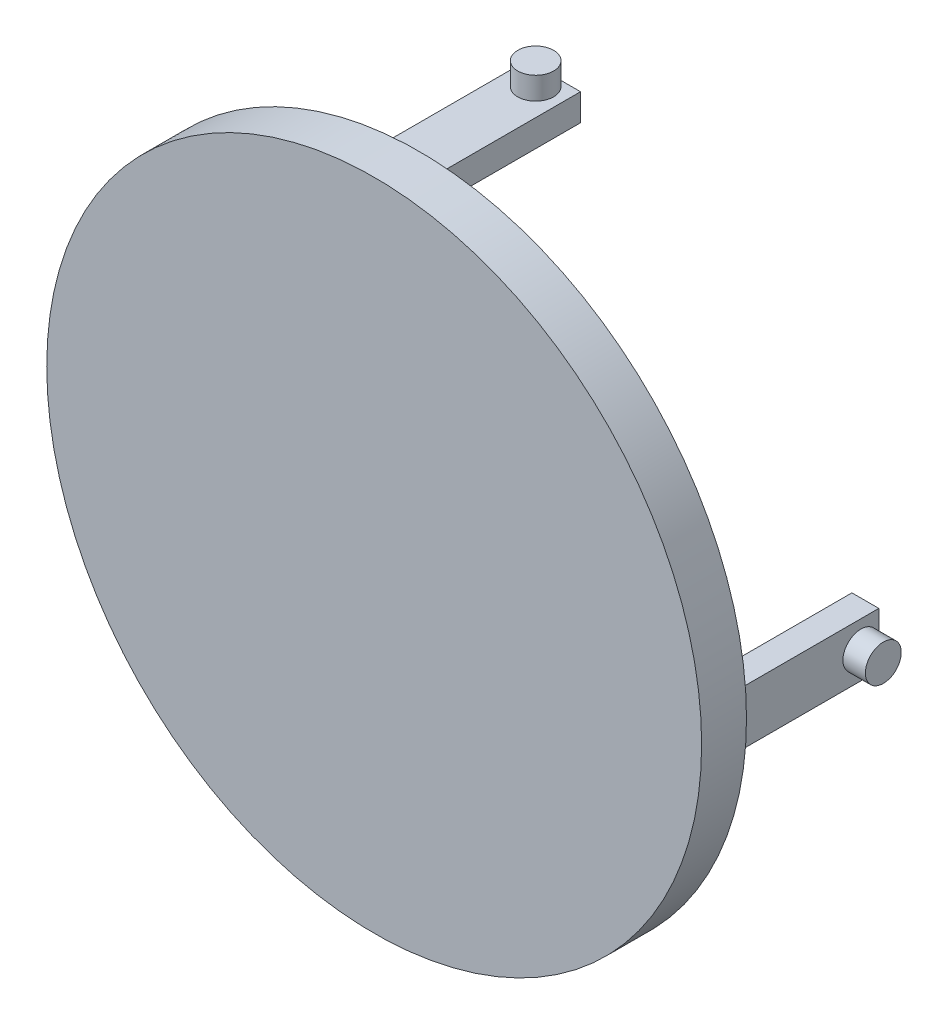
ISO-10303-21;
HEADER;
FILE_DESCRIPTION(('STEP AP214'),'2;1');
FILE_NAME('part.step','',(''),(''),'','','');
FILE_SCHEMA(('AUTOMOTIVE_DESIGN { 1 0 10303 214 1 1 1 1 }'));
ENDSEC;
DATA;
#1=APPLICATION_CONTEXT('core data for automotive mechanical design processes');
#2=APPLICATION_PROTOCOL_DEFINITION('international standard','automotive_design',2000,#1);
#3=PRODUCT_CONTEXT('',#1,'mechanical');
#4=PRODUCT('Part','Part','',(#3));
#5=PRODUCT_RELATED_PRODUCT_CATEGORY('part','',(#4));
#6=PRODUCT_DEFINITION_FORMATION('','',#4);
#7=PRODUCT_DEFINITION_CONTEXT('part definition',#1,'design');
#8=PRODUCT_DEFINITION('design','',#6,#7);
#9=PRODUCT_DEFINITION_SHAPE('','',#8);
#10=(LENGTH_UNIT() NAMED_UNIT(*) SI_UNIT(.MILLI.,.METRE.));
#11=(NAMED_UNIT(*) PLANE_ANGLE_UNIT() SI_UNIT($,.RADIAN.));
#12=(NAMED_UNIT(*) SI_UNIT($,.STERADIAN.) SOLID_ANGLE_UNIT());
#13=UNCERTAINTY_MEASURE_WITH_UNIT(LENGTH_MEASURE(1.E-05),#10,'distance_accuracy_value','');
#14=(GEOMETRIC_REPRESENTATION_CONTEXT(3) GLOBAL_UNCERTAINTY_ASSIGNED_CONTEXT((#13)) GLOBAL_UNIT_ASSIGNED_CONTEXT((#10,
#11,#12)) REPRESENTATION_CONTEXT('',''));
#15=CARTESIAN_POINT('',(0.,0.,0.));
#16=DIRECTION('',(0.,0.,1.));
#17=DIRECTION('',(1.,0.,0.));
#18=AXIS2_PLACEMENT_3D('',#15,#16,#17);
#19=CARTESIAN_POINT('',(0.,0.,0.));
#20=DIRECTION('',(0.,0.,1.));
#21=DIRECTION('',(1.,0.,0.));
#22=AXIS2_PLACEMENT_3D('',#19,#20,#21);
#23=PLANE('',#22);
#24=DIRECTION('',(0.,-1.,0.));
#25=VECTOR('',#24,1.);
#26=CARTESIAN_POINT('',(-33.25,-2.99999999999998,0.));
#27=LINE('',#26,#25);
#28=CARTESIAN_POINT('',(-33.25,3.00000000000002,0.));
#29=VERTEX_POINT('',#28);
#30=CARTESIAN_POINT('',(-33.25,-2.99999999999998,0.));
#31=VERTEX_POINT('',#30);
#32=EDGE_CURVE('E278',#29,#31,#27,.T.);
#33=ORIENTED_EDGE('',*,*,#32,.F.);
#34=DIRECTION('',(1.,0.,0.));
#35=VECTOR('',#34,1.);
#36=CARTESIAN_POINT('',(-33.25,3.00000000000002,0.));
#37=LINE('',#36,#35);
#38=CARTESIAN_POINT('',(-36.25,3.00000000000002,0.));
#39=VERTEX_POINT('',#38);
#40=EDGE_CURVE('E284',#39,#29,#37,.T.);
#41=ORIENTED_EDGE('',*,*,#40,.F.);
#42=DIRECTION('',(0.,1.,0.));
#43=VECTOR('',#42,1.);
#44=CARTESIAN_POINT('',(-36.25,3.00000000000002,0.));
#45=LINE('',#44,#43);
#46=CARTESIAN_POINT('',(-36.25,-2.99999999999998,0.));
#47=VERTEX_POINT('',#46);
#48=EDGE_CURVE('E303',#47,#39,#45,.T.);
#49=ORIENTED_EDGE('',*,*,#48,.F.);
#50=DIRECTION('',(-1.,0.,0.));
#51=VECTOR('',#50,1.);
#52=CARTESIAN_POINT('',(-36.25,-2.99999999999998,0.));
#53=LINE('',#52,#51);
#54=EDGE_CURVE('E299',#31,#47,#53,.T.);
#55=ORIENTED_EDGE('',*,*,#54,.F.);
#56=EDGE_LOOP('',(#33,#41,#49,#55));
#57=FACE_BOUND('',#56,.T.);
#58=DIRECTION('',(-1.,0.,0.));
#59=VECTOR('',#58,1.);
#60=CARTESIAN_POINT('',(33.25,-3.00000000000002,0.));
#61=LINE('',#60,#59);
#62=CARTESIAN_POINT('',(36.25,-3.00000000000002,0.));
#63=VERTEX_POINT('',#62);
#64=CARTESIAN_POINT('',(33.25,-3.00000000000002,0.));
#65=VERTEX_POINT('',#64);
#66=EDGE_CURVE('E189',#63,#65,#61,.T.);
#67=ORIENTED_EDGE('',*,*,#66,.F.);
#68=DIRECTION('',(0.,-1.,0.));
#69=VECTOR('',#68,1.);
#70=CARTESIAN_POINT('',(36.25,2.99999999999998,0.));
#71=LINE('',#70,#69);
#72=CARTESIAN_POINT('',(36.25,2.99999999999998,0.));
#73=VERTEX_POINT('',#72);
#74=EDGE_CURVE('E202',#73,#63,#71,.T.);
#75=ORIENTED_EDGE('',*,*,#74,.F.);
#76=DIRECTION('',(1.,0.,0.));
#77=VECTOR('',#76,1.);
#78=CARTESIAN_POINT('',(36.25,2.99999999999998,0.));
#79=LINE('',#78,#77);
#80=CARTESIAN_POINT('',(33.25,2.99999999999998,0.));
#81=VERTEX_POINT('',#80);
#82=EDGE_CURVE('E198',#81,#73,#79,.T.);
#83=ORIENTED_EDGE('',*,*,#82,.F.);
#84=DIRECTION('',(0.,1.,0.));
#85=VECTOR('',#84,1.);
#86=CARTESIAN_POINT('',(33.25,2.99999999999998,0.));
#87=LINE('',#86,#85);
#88=EDGE_CURVE('E193',#65,#81,#87,.T.);
#89=ORIENTED_EDGE('',*,*,#88,.F.);
#90=EDGE_LOOP('',(#67,#75,#83,#89));
#91=FACE_BOUND('',#90,.T.);
#92=CARTESIAN_POINT('',(0.,0.,0.));
#93=DIRECTION('',(0.,0.,1.));
#94=DIRECTION('',(1.,0.,0.));
#95=AXIS2_PLACEMENT_3D('',#92,#93,#94);
#96=CIRCLE('',#95,36.5);
#97=CARTESIAN_POINT('',(36.5,0.,0.));
#98=VERTEX_POINT('',#97);
#99=EDGE_CURVE('E43',#98,#98,#96,.T.);
#100=ORIENTED_EDGE('',*,*,#99,.F.);
#101=EDGE_LOOP('',(#100));
#102=FACE_BOUND('',#101,.T.);
#103=DIRECTION('',(0.,1.,0.));
#104=VECTOR('',#103,1.);
#105=CARTESIAN_POINT('',(-2.99999999999998,33.25,0.));
#106=LINE('',#105,#104);
#107=CARTESIAN_POINT('',(-2.99999999999998,33.25,0.));
#108=VERTEX_POINT('',#107);
#109=CARTESIAN_POINT('',(-2.99999999999998,36.25,0.));
#110=VERTEX_POINT('',#109);
#111=EDGE_CURVE('E230',#108,#110,#106,.T.);
#112=ORIENTED_EDGE('',*,*,#111,.F.);
#113=DIRECTION('',(-1.,0.,0.));
#114=VECTOR('',#113,1.);
#115=CARTESIAN_POINT('',(3.00000000000002,33.25,0.));
#116=LINE('',#115,#114);
#117=CARTESIAN_POINT('',(3.00000000000002,33.25,0.));
#118=VERTEX_POINT('',#117);
#119=EDGE_CURVE('E330',#118,#108,#116,.T.);
#120=ORIENTED_EDGE('',*,*,#119,.F.);
#121=DIRECTION('',(0.,-1.,0.));
#122=VECTOR('',#121,1.);
#123=CARTESIAN_POINT('',(3.00000000000002,36.25,0.));
#124=LINE('',#123,#122);
#125=CARTESIAN_POINT('',(3.00000000000002,36.25,0.));
#126=VERTEX_POINT('',#125);
#127=EDGE_CURVE('E348',#126,#118,#124,.T.);
#128=ORIENTED_EDGE('',*,*,#127,.F.);
#129=DIRECTION('',(1.,0.,0.));
#130=VECTOR('',#129,1.);
#131=CARTESIAN_POINT('',(-2.99999999999998,36.25,0.));
#132=LINE('',#131,#130);
#133=EDGE_CURVE('E344',#110,#126,#132,.T.);
#134=ORIENTED_EDGE('',*,*,#133,.F.);
#135=EDGE_LOOP('',(#112,#120,#128,#134));
#136=FACE_BOUND('',#135,.T.);
#137=DIRECTION('',(1.,0.,0.));
#138=VECTOR('',#137,1.);
#139=CARTESIAN_POINT('',(2.99999999999997,-33.25,0.));
#140=LINE('',#139,#138);
#141=CARTESIAN_POINT('',(-3.00000000000003,-33.25,0.));
#142=VERTEX_POINT('',#141);
#143=CARTESIAN_POINT('',(2.99999999999997,-33.25,0.));
#144=VERTEX_POINT('',#143);
#145=EDGE_CURVE('E233',#142,#144,#140,.T.);
#146=ORIENTED_EDGE('',*,*,#145,.F.);
#147=DIRECTION('',(0.,1.,0.));
#148=VECTOR('',#147,1.);
#149=CARTESIAN_POINT('',(-3.00000000000003,-33.25,0.));
#150=LINE('',#149,#148);
#151=CARTESIAN_POINT('',(-3.00000000000003,-36.25,0.));
#152=VERTEX_POINT('',#151);
#153=EDGE_CURVE('E235',#152,#142,#150,.T.);
#154=ORIENTED_EDGE('',*,*,#153,.F.);
#155=DIRECTION('',(-1.,0.,0.));
#156=VECTOR('',#155,1.);
#157=CARTESIAN_POINT('',(-3.00000000000003,-36.25,0.));
#158=LINE('',#157,#156);
#159=CARTESIAN_POINT('',(2.99999999999997,-36.25,0.));
#160=VERTEX_POINT('',#159);
#161=EDGE_CURVE('E257',#160,#152,#158,.T.);
#162=ORIENTED_EDGE('',*,*,#161,.F.);
#163=DIRECTION('',(0.,-1.,0.));
#164=VECTOR('',#163,1.);
#165=CARTESIAN_POINT('',(2.99999999999997,-36.25,0.));
#166=LINE('',#165,#164);
#167=EDGE_CURVE('E238',#144,#160,#166,.T.);
#168=ORIENTED_EDGE('',*,*,#167,.F.);
#169=EDGE_LOOP('',(#146,#154,#162,#168));
#170=FACE_BOUND('',#169,.T.);
#171=ADVANCED_FACE('F39',(#57,#91,#102,#136,#170),#23,.F.);
#172=CARTESIAN_POINT('',(0.,0.,5.));
#173=DIRECTION('',(0.,0.,-1.));
#174=DIRECTION('',(-1.,0.,0.));
#175=AXIS2_PLACEMENT_3D('',#172,#173,#174);
#176=CYLINDRICAL_SURFACE('',#175,36.5);
#177=CARTESIAN_POINT('',(0.,0.,5.));
#178=DIRECTION('',(0.,0.,1.));
#179=DIRECTION('',(1.,0.,0.));
#180=AXIS2_PLACEMENT_3D('',#177,#178,#179);
#181=CIRCLE('',#180,36.5);
#182=CARTESIAN_POINT('',(36.5,0.,5.));
#183=VERTEX_POINT('',#182);
#184=EDGE_CURVE('E11',#183,#183,#181,.T.);
#185=ORIENTED_EDGE('',*,*,#184,.F.);
#186=EDGE_LOOP('',(#185));
#187=FACE_BOUND('',#186,.T.);
#188=ORIENTED_EDGE('',*,*,#99,.T.);
#189=EDGE_LOOP('',(#188));
#190=FACE_BOUND('',#189,.T.);
#191=ADVANCED_FACE('F41',(#187,#190),#176,.T.);
#192=CARTESIAN_POINT('',(0.,0.,5.));
#193=DIRECTION('',(0.,0.,1.));
#194=DIRECTION('',(1.,0.,0.));
#195=AXIS2_PLACEMENT_3D('',#192,#193,#194);
#196=PLANE('',#195);
#197=ORIENTED_EDGE('',*,*,#184,.T.);
#198=EDGE_LOOP('',(#197));
#199=FACE_BOUND('',#198,.T.);
#200=ADVANCED_FACE('F378',(#199),#196,.T.);
#201=CARTESIAN_POINT('',(33.25,-3.00000000000002,-15.));
#202=DIRECTION('',(0.,1.,0.));
#203=DIRECTION('',(-1.,0.,0.));
#204=AXIS2_PLACEMENT_3D('',#201,#202,#203);
#205=PLANE('',#204);
#206=ORIENTED_EDGE('',*,*,#66,.T.);
#207=DIRECTION('',(0.,0.,1.));
#208=VECTOR('',#207,1.);
#209=CARTESIAN_POINT('',(33.25,-3.00000000000002,-15.));
#210=LINE('',#209,#208);
#211=CARTESIAN_POINT('',(33.25,-3.00000000000002,-15.));
#212=VERTEX_POINT('',#211);
#213=EDGE_CURVE('E215',#212,#65,#210,.T.);
#214=ORIENTED_EDGE('',*,*,#213,.F.);
#215=DIRECTION('',(-1.,0.,0.));
#216=VECTOR('',#215,1.);
#217=CARTESIAN_POINT('',(33.25,-3.00000000000002,-15.));
#218=LINE('',#217,#216);
#219=CARTESIAN_POINT('',(36.25,-3.00000000000002,-15.));
#220=VERTEX_POINT('',#219);
#221=EDGE_CURVE('E205',#220,#212,#218,.T.);
#222=ORIENTED_EDGE('',*,*,#221,.F.);
#223=DIRECTION('',(0.,0.,1.));
#224=VECTOR('',#223,1.);
#225=CARTESIAN_POINT('',(36.25,-3.00000000000002,-15.));
#226=LINE('',#225,#224);
#227=EDGE_CURVE('E175',#220,#63,#226,.T.);
#228=ORIENTED_EDGE('',*,*,#227,.T.);
#229=EDGE_LOOP('',(#206,#214,#222,#228));
#230=FACE_BOUND('',#229,.T.);
#231=ADVANCED_FACE('F376',(#230),#205,.F.);
#232=CARTESIAN_POINT('',(33.25,2.99999999999998,-15.));
#233=DIRECTION('',(1.,0.,0.));
#234=DIRECTION('',(0.,0.,-1.));
#235=AXIS2_PLACEMENT_3D('',#232,#233,#234);
#236=PLANE('',#235);
#237=ORIENTED_EDGE('',*,*,#88,.T.);
#238=DIRECTION('',(0.,0.,1.));
#239=VECTOR('',#238,1.);
#240=CARTESIAN_POINT('',(33.25,2.99999999999998,-15.));
#241=LINE('',#240,#239);
#242=CARTESIAN_POINT('',(33.25,2.99999999999998,-15.));
#243=VERTEX_POINT('',#242);
#244=EDGE_CURVE('E211',#243,#81,#241,.T.);
#245=ORIENTED_EDGE('',*,*,#244,.F.);
#246=DIRECTION('',(0.,1.,0.));
#247=VECTOR('',#246,1.);
#248=CARTESIAN_POINT('',(33.25,2.99999999999998,-15.));
#249=LINE('',#248,#247);
#250=EDGE_CURVE('E185',#212,#243,#249,.T.);
#251=ORIENTED_EDGE('',*,*,#250,.F.);
#252=ORIENTED_EDGE('',*,*,#213,.T.);
#253=EDGE_LOOP('',(#237,#245,#251,#252));
#254=FACE_BOUND('',#253,.T.);
#255=ADVANCED_FACE('F371',(#254),#236,.F.);
#256=CARTESIAN_POINT('',(36.25,2.99999999999998,-15.));
#257=DIRECTION('',(0.,-1.,0.));
#258=DIRECTION('',(0.,0.,-1.));
#259=AXIS2_PLACEMENT_3D('',#256,#257,#258);
#260=PLANE('',#259);
#261=ORIENTED_EDGE('',*,*,#82,.T.);
#262=DIRECTION('',(0.,0.,1.));
#263=VECTOR('',#262,1.);
#264=CARTESIAN_POINT('',(36.25,2.99999999999998,-15.));
#265=LINE('',#264,#263);
#266=CARTESIAN_POINT('',(36.25,2.99999999999998,-15.));
#267=VERTEX_POINT('',#266);
#268=EDGE_CURVE('E208',#267,#73,#265,.T.);
#269=ORIENTED_EDGE('',*,*,#268,.F.);
#270=DIRECTION('',(1.,0.,0.));
#271=VECTOR('',#270,1.);
#272=CARTESIAN_POINT('',(36.25,2.99999999999998,-15.));
#273=LINE('',#272,#271);
#274=EDGE_CURVE('E169',#243,#267,#273,.T.);
#275=ORIENTED_EDGE('',*,*,#274,.F.);
#276=ORIENTED_EDGE('',*,*,#244,.T.);
#277=EDGE_LOOP('',(#261,#269,#275,#276));
#278=FACE_BOUND('',#277,.T.);
#279=ADVANCED_FACE('F373',(#278),#260,.F.);
#280=CARTESIAN_POINT('',(36.25,2.99999999999998,-15.));
#281=DIRECTION('',(-1.,0.,0.));
#282=DIRECTION('',(0.,0.,1.));
#283=AXIS2_PLACEMENT_3D('',#280,#281,#282);
#284=PLANE('',#283);
#285=DIRECTION('',(0.,-1.,0.));
#286=VECTOR('',#285,1.);
#287=CARTESIAN_POINT('',(36.25,2.99999999999998,-15.));
#288=LINE('',#287,#286);
#289=CARTESIAN_POINT('',(36.25,0.,-15.));
#290=VERTEX_POINT('',#289);
#291=EDGE_CURVE('E166',#290,#220,#288,.T.);
#292=ORIENTED_EDGE('',*,*,#291,.F.);
#293=CARTESIAN_POINT('',(36.25,0.,-13.));
#294=DIRECTION('',(1.,0.,0.));
#295=DIRECTION('',(0.,0.,-1.));
#296=AXIS2_PLACEMENT_3D('',#293,#294,#295);
#297=CIRCLE('',#296,2.);
#298=EDGE_CURVE('E179',#290,#290,#297,.T.);
#299=ORIENTED_EDGE('',*,*,#298,.F.);
#300=EDGE_CURVE('E162',#267,#290,#288,.T.);
#301=ORIENTED_EDGE('',*,*,#300,.F.);
#302=ORIENTED_EDGE('',*,*,#268,.T.);
#303=ORIENTED_EDGE('',*,*,#74,.T.);
#304=ORIENTED_EDGE('',*,*,#227,.F.);
#305=EDGE_LOOP('',(#292,#299,#301,#302,#303,#304));
#306=FACE_BOUND('',#305,.T.);
#307=ADVANCED_FACE('F177',(#306),#284,.F.);
#308=CARTESIAN_POINT('',(0.,0.,-15.));
#309=DIRECTION('',(0.,0.,-1.));
#310=DIRECTION('',(-1.,0.,0.));
#311=AXIS2_PLACEMENT_3D('',#308,#309,#310);
#312=PLANE('',#311);
#313=ORIENTED_EDGE('',*,*,#221,.T.);
#314=ORIENTED_EDGE('',*,*,#250,.T.);
#315=ORIENTED_EDGE('',*,*,#274,.T.);
#316=ORIENTED_EDGE('',*,*,#300,.T.);
#317=ORIENTED_EDGE('',*,*,#291,.T.);
#318=EDGE_LOOP('',(#313,#314,#315,#316,#317));
#319=FACE_BOUND('',#318,.T.);
#320=ADVANCED_FACE('F165',(#319),#312,.T.);
#321=CARTESIAN_POINT('',(-2.99999999999998,33.25,-15.));
#322=DIRECTION('',(1.,0.,0.));
#323=DIRECTION('',(0.,0.,-1.));
#324=AXIS2_PLACEMENT_3D('',#321,#322,#323);
#325=PLANE('',#324);
#326=ORIENTED_EDGE('',*,*,#111,.T.);
#327=DIRECTION('',(0.,0.,1.));
#328=VECTOR('',#327,1.);
#329=CARTESIAN_POINT('',(-2.99999999999998,36.25,-15.));
#330=LINE('',#329,#328);
#331=CARTESIAN_POINT('',(-2.99999999999998,36.25,-15.));
#332=VERTEX_POINT('',#331);
#333=EDGE_CURVE('E194',#332,#110,#330,.T.);
#334=ORIENTED_EDGE('',*,*,#333,.F.);
#335=DIRECTION('',(0.,1.,0.));
#336=VECTOR('',#335,1.);
#337=CARTESIAN_POINT('',(-2.99999999999998,33.25,-15.));
#338=LINE('',#337,#336);
#339=CARTESIAN_POINT('',(-2.99999999999998,33.25,-15.));
#340=VERTEX_POINT('',#339);
#341=EDGE_CURVE('E325',#340,#332,#338,.T.);
#342=ORIENTED_EDGE('',*,*,#341,.F.);
#343=DIRECTION('',(0.,0.,1.));
#344=VECTOR('',#343,1.);
#345=CARTESIAN_POINT('',(-2.99999999999998,33.25,-15.));
#346=LINE('',#345,#344);
#347=EDGE_CURVE('E341',#340,#108,#346,.T.);
#348=ORIENTED_EDGE('',*,*,#347,.T.);
#349=EDGE_LOOP('',(#326,#334,#342,#348));
#350=FACE_BOUND('',#349,.T.);
#351=ADVANCED_FACE('F394',(#350),#325,.F.);
#352=CARTESIAN_POINT('',(-2.99999999999998,36.25,-15.));
#353=DIRECTION('',(0.,-1.,0.));
#354=DIRECTION('',(0.,0.,-1.));
#355=AXIS2_PLACEMENT_3D('',#352,#353,#354);
#356=PLANE('',#355);
#357=DIRECTION('',(1.,0.,0.));
#358=VECTOR('',#357,1.);
#359=CARTESIAN_POINT('',(-2.99999999999998,36.25,-15.));
#360=LINE('',#359,#358);
#361=CARTESIAN_POINT('',(0.,36.25,-15.));
#362=VERTEX_POINT('',#361);
#363=CARTESIAN_POINT('',(3.00000000000002,36.25,-15.));
#364=VERTEX_POINT('',#363);
#365=EDGE_CURVE('E329',#362,#364,#360,.T.);
#366=ORIENTED_EDGE('',*,*,#365,.F.);
#367=CARTESIAN_POINT('',(0.,36.25,-13.));
#368=DIRECTION('',(0.,-1.,0.));
#369=DIRECTION('',(0.,0.,-1.));
#370=AXIS2_PLACEMENT_3D('',#367,#368,#369);
#371=CIRCLE('',#370,2.);
#372=EDGE_CURVE('E53',#362,#362,#371,.T.);
#373=ORIENTED_EDGE('',*,*,#372,.T.);
#374=EDGE_CURVE('E331',#332,#362,#360,.T.);
#375=ORIENTED_EDGE('',*,*,#374,.F.);
#376=ORIENTED_EDGE('',*,*,#333,.T.);
#377=ORIENTED_EDGE('',*,*,#133,.T.);
#378=DIRECTION('',(0.,0.,1.));
#379=VECTOR('',#378,1.);
#380=CARTESIAN_POINT('',(3.00000000000002,36.25,-15.));
#381=LINE('',#380,#379);
#382=EDGE_CURVE('E361',#364,#126,#381,.T.);
#383=ORIENTED_EDGE('',*,*,#382,.F.);
#384=EDGE_LOOP('',(#366,#373,#375,#376,#377,#383));
#385=FACE_BOUND('',#384,.T.);
#386=ADVANCED_FACE('F397',(#385),#356,.F.);
#387=CARTESIAN_POINT('',(3.00000000000002,36.25,-15.));
#388=DIRECTION('',(-1.,0.,0.));
#389=DIRECTION('',(0.,0.,1.));
#390=AXIS2_PLACEMENT_3D('',#387,#388,#389);
#391=PLANE('',#390);
#392=ORIENTED_EDGE('',*,*,#127,.T.);
#393=DIRECTION('',(0.,0.,1.));
#394=VECTOR('',#393,1.);
#395=CARTESIAN_POINT('',(3.00000000000002,33.25,-15.));
#396=LINE('',#395,#394);
#397=CARTESIAN_POINT('',(3.00000000000002,33.25,-15.));
#398=VERTEX_POINT('',#397);
#399=EDGE_CURVE('E357',#398,#118,#396,.T.);
#400=ORIENTED_EDGE('',*,*,#399,.F.);
#401=DIRECTION('',(0.,-1.,0.));
#402=VECTOR('',#401,1.);
#403=CARTESIAN_POINT('',(3.00000000000002,36.25,-15.));
#404=LINE('',#403,#402);
#405=EDGE_CURVE('E335',#364,#398,#404,.T.);
#406=ORIENTED_EDGE('',*,*,#405,.F.);
#407=ORIENTED_EDGE('',*,*,#382,.T.);
#408=EDGE_LOOP('',(#392,#400,#406,#407));
#409=FACE_BOUND('',#408,.T.);
#410=ADVANCED_FACE('F401',(#409),#391,.F.);
#411=CARTESIAN_POINT('',(3.00000000000002,33.25,-15.));
#412=DIRECTION('',(0.,1.,0.));
#413=DIRECTION('',(0.,0.,1.));
#414=AXIS2_PLACEMENT_3D('',#411,#412,#413);
#415=PLANE('',#414);
#416=ORIENTED_EDGE('',*,*,#119,.T.);
#417=ORIENTED_EDGE('',*,*,#347,.F.);
#418=DIRECTION('',(-1.,0.,0.));
#419=VECTOR('',#418,1.);
#420=CARTESIAN_POINT('',(3.00000000000002,33.25,-15.));
#421=LINE('',#420,#419);
#422=EDGE_CURVE('E338',#398,#340,#421,.T.);
#423=ORIENTED_EDGE('',*,*,#422,.F.);
#424=ORIENTED_EDGE('',*,*,#399,.T.);
#425=EDGE_LOOP('',(#416,#417,#423,#424));
#426=FACE_BOUND('',#425,.T.);
#427=ADVANCED_FACE('F405',(#426),#415,.F.);
#428=CARTESIAN_POINT('',(0.,0.,-15.));
#429=DIRECTION('',(0.,0.,-1.));
#430=DIRECTION('',(-1.,0.,0.));
#431=AXIS2_PLACEMENT_3D('',#428,#429,#430);
#432=PLANE('',#431);
#433=ORIENTED_EDGE('',*,*,#341,.T.);
#434=ORIENTED_EDGE('',*,*,#374,.T.);
#435=ORIENTED_EDGE('',*,*,#365,.T.);
#436=ORIENTED_EDGE('',*,*,#405,.T.);
#437=ORIENTED_EDGE('',*,*,#422,.T.);
#438=EDGE_LOOP('',(#433,#434,#435,#436,#437));
#439=FACE_BOUND('',#438,.T.);
#440=ADVANCED_FACE('F409',(#439),#432,.T.);
#441=CARTESIAN_POINT('',(-33.25,-2.99999999999998,-15.));
#442=DIRECTION('',(-1.,0.,0.));
#443=DIRECTION('',(0.,0.,1.));
#444=AXIS2_PLACEMENT_3D('',#441,#442,#443);
#445=PLANE('',#444);
#446=ORIENTED_EDGE('',*,*,#32,.T.);
#447=DIRECTION('',(0.,0.,1.));
#448=VECTOR('',#447,1.);
#449=CARTESIAN_POINT('',(-33.25,-2.99999999999998,-15.));
#450=LINE('',#449,#448);
#451=CARTESIAN_POINT('',(-33.25,-2.99999999999998,-15.));
#452=VERTEX_POINT('',#451);
#453=EDGE_CURVE('E321',#452,#31,#450,.T.);
#454=ORIENTED_EDGE('',*,*,#453,.F.);
#455=DIRECTION('',(0.,-1.,0.));
#456=VECTOR('',#455,1.);
#457=CARTESIAN_POINT('',(-33.25,-2.99999999999998,-15.));
#458=LINE('',#457,#456);
#459=CARTESIAN_POINT('',(-33.25,3.00000000000002,-15.));
#460=VERTEX_POINT('',#459);
#461=EDGE_CURVE('E279',#460,#452,#458,.T.);
#462=ORIENTED_EDGE('',*,*,#461,.F.);
#463=DIRECTION('',(0.,0.,1.));
#464=VECTOR('',#463,1.);
#465=CARTESIAN_POINT('',(-33.25,3.00000000000002,-15.));
#466=LINE('',#465,#464);
#467=EDGE_CURVE('E295',#460,#29,#466,.T.);
#468=ORIENTED_EDGE('',*,*,#467,.T.);
#469=EDGE_LOOP('',(#446,#454,#462,#468));
#470=FACE_BOUND('',#469,.T.);
#471=ADVANCED_FACE('F413',(#470),#445,.F.);
#472=CARTESIAN_POINT('',(-36.25,-2.99999999999998,-15.));
#473=DIRECTION('',(0.,1.,0.));
#474=DIRECTION('',(0.,0.,1.));
#475=AXIS2_PLACEMENT_3D('',#472,#473,#474);
#476=PLANE('',#475);
#477=ORIENTED_EDGE('',*,*,#54,.T.);
#478=DIRECTION('',(0.,0.,1.));
#479=VECTOR('',#478,1.);
#480=CARTESIAN_POINT('',(-36.25,-2.99999999999998,-15.));
#481=LINE('',#480,#479);
#482=CARTESIAN_POINT('',(-36.25,-2.99999999999998,-15.));
#483=VERTEX_POINT('',#482);
#484=EDGE_CURVE('E317',#483,#47,#481,.T.);
#485=ORIENTED_EDGE('',*,*,#484,.F.);
#486=DIRECTION('',(-1.,0.,0.));
#487=VECTOR('',#486,1.);
#488=CARTESIAN_POINT('',(-36.25,-2.99999999999998,-15.));
#489=LINE('',#488,#487);
#490=EDGE_CURVE('E283',#452,#483,#489,.T.);
#491=ORIENTED_EDGE('',*,*,#490,.F.);
#492=ORIENTED_EDGE('',*,*,#453,.T.);
#493=EDGE_LOOP('',(#477,#485,#491,#492));
#494=FACE_BOUND('',#493,.T.);
#495=ADVANCED_FACE('F417',(#494),#476,.F.);
#496=CARTESIAN_POINT('',(-36.25,3.00000000000002,-15.));
#497=DIRECTION('',(1.,0.,0.));
#498=DIRECTION('',(0.,0.,-1.));
#499=AXIS2_PLACEMENT_3D('',#496,#497,#498);
#500=PLANE('',#499);
#501=DIRECTION('',(0.,1.,0.));
#502=VECTOR('',#501,1.);
#503=CARTESIAN_POINT('',(-36.25,3.00000000000002,-15.));
#504=LINE('',#503,#502);
#505=CARTESIAN_POINT('',(-36.25,0.,-15.));
#506=VERTEX_POINT('',#505);
#507=CARTESIAN_POINT('',(-36.25,3.00000000000002,-15.));
#508=VERTEX_POINT('',#507);
#509=EDGE_CURVE('E287',#506,#508,#504,.T.);
#510=ORIENTED_EDGE('',*,*,#509,.F.);
#511=CARTESIAN_POINT('',(-36.25,0.,-13.));
#512=DIRECTION('',(1.,0.,0.));
#513=DIRECTION('',(0.,0.,-1.));
#514=AXIS2_PLACEMENT_3D('',#511,#512,#513);
#515=CIRCLE('',#514,2.);
#516=EDGE_CURVE('E58',#506,#506,#515,.T.);
#517=ORIENTED_EDGE('',*,*,#516,.T.);
#518=EDGE_CURVE('E288',#483,#506,#504,.T.);
#519=ORIENTED_EDGE('',*,*,#518,.F.);
#520=ORIENTED_EDGE('',*,*,#484,.T.);
#521=ORIENTED_EDGE('',*,*,#48,.T.);
#522=DIRECTION('',(0.,0.,1.));
#523=VECTOR('',#522,1.);
#524=CARTESIAN_POINT('',(-36.25,3.00000000000002,-15.));
#525=LINE('',#524,#523);
#526=EDGE_CURVE('E313',#508,#39,#525,.T.);
#527=ORIENTED_EDGE('',*,*,#526,.F.);
#528=EDGE_LOOP('',(#510,#517,#519,#520,#521,#527));
#529=FACE_BOUND('',#528,.T.);
#530=ADVANCED_FACE('F421',(#529),#500,.F.);
#531=CARTESIAN_POINT('',(-33.25,3.00000000000002,-15.));
#532=DIRECTION('',(0.,-1.,0.));
#533=DIRECTION('',(0.,0.,-1.));
#534=AXIS2_PLACEMENT_3D('',#531,#532,#533);
#535=PLANE('',#534);
#536=ORIENTED_EDGE('',*,*,#40,.T.);
#537=ORIENTED_EDGE('',*,*,#467,.F.);
#538=DIRECTION('',(1.,0.,0.));
#539=VECTOR('',#538,1.);
#540=CARTESIAN_POINT('',(-33.25,3.00000000000002,-15.));
#541=LINE('',#540,#539);
#542=EDGE_CURVE('E292',#508,#460,#541,.T.);
#543=ORIENTED_EDGE('',*,*,#542,.F.);
#544=ORIENTED_EDGE('',*,*,#526,.T.);
#545=EDGE_LOOP('',(#536,#537,#543,#544));
#546=FACE_BOUND('',#545,.T.);
#547=ADVANCED_FACE('F425',(#546),#535,.F.);
#548=CARTESIAN_POINT('',(0.,0.,-15.));
#549=DIRECTION('',(0.,0.,1.));
#550=DIRECTION('',(1.,0.,0.));
#551=AXIS2_PLACEMENT_3D('',#548,#549,#550);
#552=PLANE('',#551);
#553=ORIENTED_EDGE('',*,*,#461,.T.);
#554=ORIENTED_EDGE('',*,*,#490,.T.);
#555=ORIENTED_EDGE('',*,*,#518,.T.);
#556=ORIENTED_EDGE('',*,*,#509,.T.);
#557=ORIENTED_EDGE('',*,*,#542,.T.);
#558=EDGE_LOOP('',(#553,#554,#555,#556,#557));
#559=FACE_BOUND('',#558,.T.);
#560=ADVANCED_FACE('F429',(#559),#552,.F.);
#561=CARTESIAN_POINT('',(2.99999999999997,-33.25,-15.));
#562=DIRECTION('',(0.,-1.,0.));
#563=DIRECTION('',(0.,0.,-1.));
#564=AXIS2_PLACEMENT_3D('',#561,#562,#563);
#565=PLANE('',#564);
#566=ORIENTED_EDGE('',*,*,#145,.T.);
#567=DIRECTION('',(0.,0.,1.));
#568=VECTOR('',#567,1.);
#569=CARTESIAN_POINT('',(2.99999999999997,-33.25,-15.));
#570=LINE('',#569,#568);
#571=CARTESIAN_POINT('',(2.99999999999997,-33.25,-15.));
#572=VERTEX_POINT('',#571);
#573=EDGE_CURVE('E275',#572,#144,#570,.T.);
#574=ORIENTED_EDGE('',*,*,#573,.F.);
#575=DIRECTION('',(1.,0.,0.));
#576=VECTOR('',#575,1.);
#577=CARTESIAN_POINT('',(2.99999999999997,-33.25,-15.));
#578=LINE('',#577,#576);
#579=CARTESIAN_POINT('',(-3.00000000000003,-33.25,-15.));
#580=VERTEX_POINT('',#579);
#581=EDGE_CURVE('E256',#580,#572,#578,.T.);
#582=ORIENTED_EDGE('',*,*,#581,.F.);
#583=DIRECTION('',(0.,0.,1.));
#584=VECTOR('',#583,1.);
#585=CARTESIAN_POINT('',(-3.00000000000003,-33.25,-15.));
#586=LINE('',#585,#584);
#587=EDGE_CURVE('E251',#580,#142,#586,.T.);
#588=ORIENTED_EDGE('',*,*,#587,.T.);
#589=EDGE_LOOP('',(#566,#574,#582,#588));
#590=FACE_BOUND('',#589,.T.);
#591=ADVANCED_FACE('F259',(#590),#565,.F.);
#592=CARTESIAN_POINT('',(2.99999999999997,-36.25,-15.));
#593=DIRECTION('',(-1.,0.,0.));
#594=DIRECTION('',(0.,0.,1.));
#595=AXIS2_PLACEMENT_3D('',#592,#593,#594);
#596=PLANE('',#595);
#597=ORIENTED_EDGE('',*,*,#167,.T.);
#598=DIRECTION('',(0.,0.,1.));
#599=VECTOR('',#598,1.);
#600=CARTESIAN_POINT('',(2.99999999999997,-36.25,-15.));
#601=LINE('',#600,#599);
#602=CARTESIAN_POINT('',(2.99999999999997,-36.25,-15.));
#603=VERTEX_POINT('',#602);
#604=EDGE_CURVE('E266',#603,#160,#601,.T.);
#605=ORIENTED_EDGE('',*,*,#604,.F.);
#606=DIRECTION('',(0.,-1.,0.));
#607=VECTOR('',#606,1.);
#608=CARTESIAN_POINT('',(2.99999999999997,-36.25,-15.));
#609=LINE('',#608,#607);
#610=EDGE_CURVE('E512',#572,#603,#609,.T.);
#611=ORIENTED_EDGE('',*,*,#610,.F.);
#612=ORIENTED_EDGE('',*,*,#573,.T.);
#613=EDGE_LOOP('',(#597,#605,#611,#612));
#614=FACE_BOUND('',#613,.T.);
#615=ADVANCED_FACE('F436',(#614),#596,.F.);
#616=CARTESIAN_POINT('',(-3.00000000000003,-36.25,-15.));
#617=DIRECTION('',(0.,1.,0.));
#618=DIRECTION('',(0.,0.,1.));
#619=AXIS2_PLACEMENT_3D('',#616,#617,#618);
#620=PLANE('',#619);
#621=DIRECTION('',(-1.,0.,0.));
#622=VECTOR('',#621,1.);
#623=CARTESIAN_POINT('',(-3.00000000000003,-36.25,-15.));
#624=LINE('',#623,#622);
#625=CARTESIAN_POINT('',(0.,-36.25,-15.));
#626=VERTEX_POINT('',#625);
#627=CARTESIAN_POINT('',(-3.00000000000003,-36.25,-15.));
#628=VERTEX_POINT('',#627);
#629=EDGE_CURVE('E515',#626,#628,#624,.T.);
#630=ORIENTED_EDGE('',*,*,#629,.F.);
#631=CARTESIAN_POINT('',(0.,-36.25,-13.));
#632=DIRECTION('',(0.,1.,0.));
#633=DIRECTION('',(0.,0.,1.));
#634=AXIS2_PLACEMENT_3D('',#631,#632,#633);
#635=CIRCLE('',#634,2.);
#636=EDGE_CURVE('E496',#626,#626,#635,.T.);
#637=ORIENTED_EDGE('',*,*,#636,.T.);
#638=EDGE_CURVE('E268',#603,#626,#624,.T.);
#639=ORIENTED_EDGE('',*,*,#638,.F.);
#640=ORIENTED_EDGE('',*,*,#604,.T.);
#641=ORIENTED_EDGE('',*,*,#161,.T.);
#642=DIRECTION('',(0.,0.,1.));
#643=VECTOR('',#642,1.);
#644=CARTESIAN_POINT('',(-3.00000000000003,-36.25,-15.));
#645=LINE('',#644,#643);
#646=EDGE_CURVE('E254',#628,#152,#645,.T.);
#647=ORIENTED_EDGE('',*,*,#646,.F.);
#648=EDGE_LOOP('',(#630,#637,#639,#640,#641,#647));
#649=FACE_BOUND('',#648,.T.);
#650=ADVANCED_FACE('F439',(#649),#620,.F.);
#651=CARTESIAN_POINT('',(-3.00000000000003,-33.25,-15.));
#652=DIRECTION('',(1.,0.,0.));
#653=DIRECTION('',(0.,0.,-1.));
#654=AXIS2_PLACEMENT_3D('',#651,#652,#653);
#655=PLANE('',#654);
#656=ORIENTED_EDGE('',*,*,#153,.T.);
#657=ORIENTED_EDGE('',*,*,#587,.F.);
#658=DIRECTION('',(0.,1.,0.));
#659=VECTOR('',#658,1.);
#660=CARTESIAN_POINT('',(-3.00000000000003,-33.25,-15.));
#661=LINE('',#660,#659);
#662=EDGE_CURVE('E262',#628,#580,#661,.T.);
#663=ORIENTED_EDGE('',*,*,#662,.F.);
#664=ORIENTED_EDGE('',*,*,#646,.T.);
#665=EDGE_LOOP('',(#656,#657,#663,#664));
#666=FACE_BOUND('',#665,.T.);
#667=ADVANCED_FACE('F249',(#666),#655,.F.);
#668=CARTESIAN_POINT('',(0.,0.,-15.));
#669=DIRECTION('',(0.,0.,1.));
#670=DIRECTION('',(1.,0.,0.));
#671=AXIS2_PLACEMENT_3D('',#668,#669,#670);
#672=PLANE('',#671);
#673=ORIENTED_EDGE('',*,*,#581,.T.);
#674=ORIENTED_EDGE('',*,*,#610,.T.);
#675=ORIENTED_EDGE('',*,*,#638,.T.);
#676=ORIENTED_EDGE('',*,*,#629,.T.);
#677=ORIENTED_EDGE('',*,*,#662,.T.);
#678=EDGE_LOOP('',(#673,#674,#675,#676,#677));
#679=FACE_BOUND('',#678,.T.);
#680=ADVANCED_FACE('F446',(#679),#672,.F.);
#681=CARTESIAN_POINT('',(38.75,0.,-13.));
#682=DIRECTION('',(-1.,0.,0.));
#683=DIRECTION('',(0.,0.,1.));
#684=AXIS2_PLACEMENT_3D('',#681,#682,#683);
#685=CYLINDRICAL_SURFACE('',#684,2.);
#686=CARTESIAN_POINT('',(38.75,0.,-13.));
#687=DIRECTION('',(1.,0.,0.));
#688=DIRECTION('',(0.,0.,-1.));
#689=AXIS2_PLACEMENT_3D('',#686,#687,#688);
#690=CIRCLE('',#689,2.);
#691=CARTESIAN_POINT('',(38.75,0.,-15.));
#692=VERTEX_POINT('',#691);
#693=EDGE_CURVE('E244',#692,#692,#690,.T.);
#694=ORIENTED_EDGE('',*,*,#693,.F.);
#695=EDGE_LOOP('',(#694));
#696=FACE_BOUND('',#695,.T.);
#697=ORIENTED_EDGE('',*,*,#298,.T.);
#698=EDGE_LOOP('',(#697));
#699=FACE_BOUND('',#698,.T.);
#700=ADVANCED_FACE('F449',(#696,#699),#685,.T.);
#701=CARTESIAN_POINT('',(38.75,0.,-13.));
#702=DIRECTION('',(1.,0.,0.));
#703=DIRECTION('',(0.,0.,-1.));
#704=AXIS2_PLACEMENT_3D('',#701,#702,#703);
#705=PLANE('',#704);
#706=ORIENTED_EDGE('',*,*,#693,.T.);
#707=EDGE_LOOP('',(#706));
#708=FACE_BOUND('',#707,.T.);
#709=ADVANCED_FACE('F453',(#708),#705,.T.);
#710=CARTESIAN_POINT('',(0.,-38.75,-13.));
#711=DIRECTION('',(0.,1.,0.));
#712=DIRECTION('',(0.,0.,1.));
#713=AXIS2_PLACEMENT_3D('',#710,#711,#712);
#714=CYLINDRICAL_SURFACE('',#713,2.);
#715=CARTESIAN_POINT('',(0.,-38.75,-13.));
#716=DIRECTION('',(0.,1.,0.));
#717=DIRECTION('',(0.,0.,1.));
#718=AXIS2_PLACEMENT_3D('',#715,#716,#717);
#719=CIRCLE('',#718,2.);
#720=CARTESIAN_POINT('',(0.,-38.75,-11.));
#721=VERTEX_POINT('',#720);
#722=EDGE_CURVE('E498',#721,#721,#719,.T.);
#723=ORIENTED_EDGE('',*,*,#722,.T.);
#724=EDGE_LOOP('',(#723));
#725=FACE_BOUND('',#724,.T.);
#726=ORIENTED_EDGE('',*,*,#636,.F.);
#727=EDGE_LOOP('',(#726));
#728=FACE_BOUND('',#727,.T.);
#729=ADVANCED_FACE('F457',(#725,#728),#714,.T.);
#730=CARTESIAN_POINT('',(0.,-38.75,-13.));
#731=DIRECTION('',(0.,1.,0.));
#732=DIRECTION('',(0.,0.,1.));
#733=AXIS2_PLACEMENT_3D('',#730,#731,#732);
#734=PLANE('',#733);
#735=ORIENTED_EDGE('',*,*,#722,.F.);
#736=EDGE_LOOP('',(#735));
#737=FACE_BOUND('',#736,.T.);
#738=ADVANCED_FACE('F461',(#737),#734,.F.);
#739=CARTESIAN_POINT('',(-38.75,0.,-13.));
#740=DIRECTION('',(1.,0.,0.));
#741=DIRECTION('',(0.,0.,-1.));
#742=AXIS2_PLACEMENT_3D('',#739,#740,#741);
#743=CYLINDRICAL_SURFACE('',#742,2.);
#744=CARTESIAN_POINT('',(-38.75,0.,-13.));
#745=DIRECTION('',(1.,0.,0.));
#746=DIRECTION('',(0.,0.,-1.));
#747=AXIS2_PLACEMENT_3D('',#744,#745,#746);
#748=CIRCLE('',#747,2.);
#749=CARTESIAN_POINT('',(-38.75,0.,-15.));
#750=VERTEX_POINT('',#749);
#751=EDGE_CURVE('E490',#750,#750,#748,.T.);
#752=ORIENTED_EDGE('',*,*,#751,.T.);
#753=EDGE_LOOP('',(#752));
#754=FACE_BOUND('',#753,.T.);
#755=ORIENTED_EDGE('',*,*,#516,.F.);
#756=EDGE_LOOP('',(#755));
#757=FACE_BOUND('',#756,.T.);
#758=ADVANCED_FACE('F465',(#754,#757),#743,.T.);
#759=CARTESIAN_POINT('',(-38.75,0.,-13.));
#760=DIRECTION('',(1.,0.,0.));
#761=DIRECTION('',(0.,0.,-1.));
#762=AXIS2_PLACEMENT_3D('',#759,#760,#761);
#763=PLANE('',#762);
#764=ORIENTED_EDGE('',*,*,#751,.F.);
#765=EDGE_LOOP('',(#764));
#766=FACE_BOUND('',#765,.T.);
#767=ADVANCED_FACE('F469',(#766),#763,.F.);
#768=CARTESIAN_POINT('',(0.,38.75,-13.));
#769=DIRECTION('',(0.,-1.,0.));
#770=DIRECTION('',(0.,0.,-1.));
#771=AXIS2_PLACEMENT_3D('',#768,#769,#770);
#772=CYLINDRICAL_SURFACE('',#771,2.);
#773=CARTESIAN_POINT('',(0.,38.75,-13.));
#774=DIRECTION('',(0.,-1.,0.));
#775=DIRECTION('',(0.,0.,-1.));
#776=AXIS2_PLACEMENT_3D('',#773,#774,#775);
#777=CIRCLE('',#776,2.);
#778=CARTESIAN_POINT('',(0.,38.75,-15.));
#779=VERTEX_POINT('',#778);
#780=EDGE_CURVE('E485',#779,#779,#777,.T.);
#781=ORIENTED_EDGE('',*,*,#780,.T.);
#782=EDGE_LOOP('',(#781));
#783=FACE_BOUND('',#782,.T.);
#784=ORIENTED_EDGE('',*,*,#372,.F.);
#785=EDGE_LOOP('',(#784));
#786=FACE_BOUND('',#785,.T.);
#787=ADVANCED_FACE('F473',(#783,#786),#772,.T.);
#788=CARTESIAN_POINT('',(0.,38.75,-13.));
#789=DIRECTION('',(0.,-1.,0.));
#790=DIRECTION('',(0.,0.,-1.));
#791=AXIS2_PLACEMENT_3D('',#788,#789,#790);
#792=PLANE('',#791);
#793=ORIENTED_EDGE('',*,*,#780,.F.);
#794=EDGE_LOOP('',(#793));
#795=FACE_BOUND('',#794,.T.);
#796=ADVANCED_FACE('F477',(#795),#792,.F.);
#797=CLOSED_SHELL('',(#171,#191,#200,#231,#255,#279,#307,#320,#351,#386,#410,#427,#440,#471,
#495,#530,#547,#560,#591,#615,#650,#667,#680,#700,#709,#729,#738,#758,#767,#787,#796));
#798=MANIFOLD_SOLID_BREP('B2',#797);
#799=ADVANCED_BREP_SHAPE_REPRESENTATION('',(#18,#798),#14);
#800=SHAPE_DEFINITION_REPRESENTATION(#9,#799);
ENDSEC;
END-ISO-10303-21;
